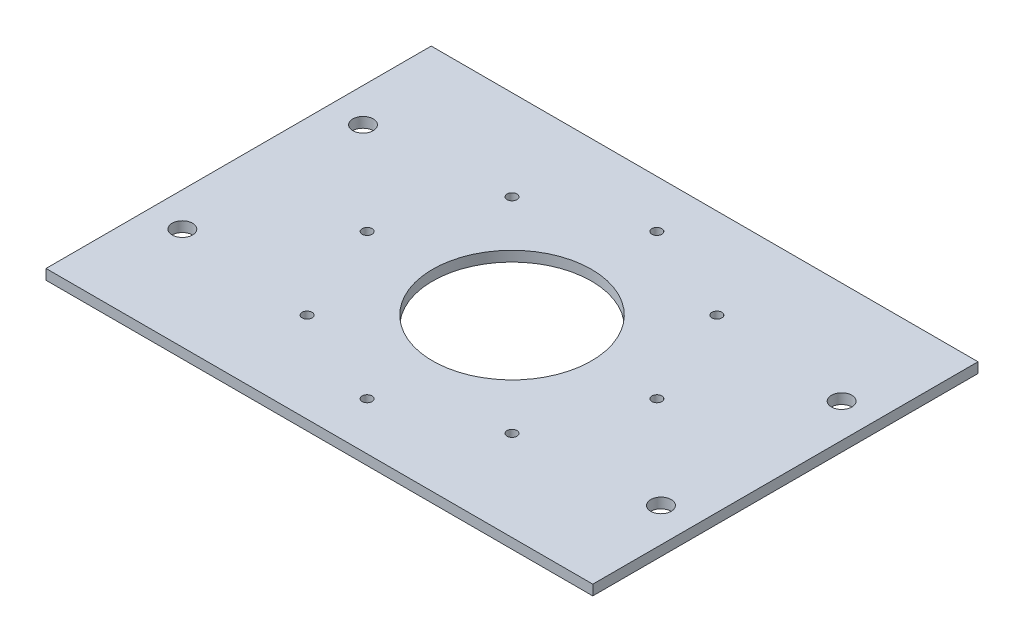
ISO-10303-21;
HEADER;
FILE_DESCRIPTION(('STEP AP214'),'2;1');
FILE_NAME('part.step','',(''),(''),'','','');
FILE_SCHEMA(('AUTOMOTIVE_DESIGN { 1 0 10303 214 1 1 1 1 }'));
ENDSEC;
DATA;
#1=APPLICATION_CONTEXT('core data for automotive mechanical design processes');
#2=APPLICATION_PROTOCOL_DEFINITION('international standard','automotive_design',2000,#1);
#3=PRODUCT_CONTEXT('',#1,'mechanical');
#4=PRODUCT('Part','Part','',(#3));
#5=PRODUCT_RELATED_PRODUCT_CATEGORY('part','',(#4));
#6=PRODUCT_DEFINITION_FORMATION('','',#4);
#7=PRODUCT_DEFINITION_CONTEXT('part definition',#1,'design');
#8=PRODUCT_DEFINITION('design','',#6,#7);
#9=PRODUCT_DEFINITION_SHAPE('','',#8);
#10=(LENGTH_UNIT() NAMED_UNIT(*) SI_UNIT(.MILLI.,.METRE.));
#11=(NAMED_UNIT(*) PLANE_ANGLE_UNIT() SI_UNIT($,.RADIAN.));
#12=(NAMED_UNIT(*) SI_UNIT($,.STERADIAN.) SOLID_ANGLE_UNIT());
#13=UNCERTAINTY_MEASURE_WITH_UNIT(LENGTH_MEASURE(1.E-05),#10,'distance_accuracy_value','');
#14=(GEOMETRIC_REPRESENTATION_CONTEXT(3) GLOBAL_UNCERTAINTY_ASSIGNED_CONTEXT((#13)) GLOBAL_UNIT_ASSIGNED_CONTEXT((#10,
#11,#12)) REPRESENTATION_CONTEXT('',''));
#15=CARTESIAN_POINT('',(0.,0.,0.));
#16=DIRECTION('',(0.,0.,1.));
#17=DIRECTION('',(1.,0.,0.));
#18=AXIS2_PLACEMENT_3D('',#15,#16,#17);
#19=CARTESIAN_POINT('',(80.2,3.,-56.5));
#20=DIRECTION('',(-1.,0.,0.));
#21=DIRECTION('',(0.,0.,1.));
#22=AXIS2_PLACEMENT_3D('',#19,#20,#21);
#23=PLANE('',#22);
#24=DIRECTION('',(0.,0.,-1.));
#25=VECTOR('',#24,1.);
#26=CARTESIAN_POINT('',(80.2,0.,-56.5));
#27=LINE('',#26,#25);
#28=CARTESIAN_POINT('',(80.2,0.,56.5));
#29=VERTEX_POINT('',#28);
#30=CARTESIAN_POINT('',(80.2,0.,-56.5));
#31=VERTEX_POINT('',#30);
#32=EDGE_CURVE('E107',#29,#31,#27,.T.);
#33=ORIENTED_EDGE('',*,*,#32,.T.);
#34=DIRECTION('',(0.,-1.,0.));
#35=VECTOR('',#34,1.);
#36=CARTESIAN_POINT('',(80.2,3.,-56.5));
#37=LINE('',#36,#35);
#38=CARTESIAN_POINT('',(80.2,3.,-56.5));
#39=VERTEX_POINT('',#38);
#40=EDGE_CURVE('E11',#39,#31,#37,.T.);
#41=ORIENTED_EDGE('',*,*,#40,.F.);
#42=DIRECTION('',(0.,0.,-1.));
#43=VECTOR('',#42,1.);
#44=CARTESIAN_POINT('',(80.2,3.,-56.5));
#45=LINE('',#44,#43);
#46=CARTESIAN_POINT('',(80.2,3.,56.5));
#47=VERTEX_POINT('',#46);
#48=EDGE_CURVE('E95',#47,#39,#45,.T.);
#49=ORIENTED_EDGE('',*,*,#48,.F.);
#50=DIRECTION('',(0.,-1.,0.));
#51=VECTOR('',#50,1.);
#52=CARTESIAN_POINT('',(80.2,3.,56.5));
#53=LINE('',#52,#51);
#54=EDGE_CURVE('E103',#47,#29,#53,.T.);
#55=ORIENTED_EDGE('',*,*,#54,.T.);
#56=EDGE_LOOP('',(#33,#41,#49,#55));
#57=FACE_BOUND('',#56,.T.);
#58=ADVANCED_FACE('F44',(#57),#23,.F.);
#59=CARTESIAN_POINT('',(-80.2,3.,-56.5));
#60=DIRECTION('',(0.,0.,1.));
#61=DIRECTION('',(1.,0.,0.));
#62=AXIS2_PLACEMENT_3D('',#59,#60,#61);
#63=PLANE('',#62);
#64=DIRECTION('',(-1.,0.,0.));
#65=VECTOR('',#64,1.);
#66=CARTESIAN_POINT('',(-80.2,0.,-56.5));
#67=LINE('',#66,#65);
#68=CARTESIAN_POINT('',(-80.2,0.,-56.5));
#69=VERTEX_POINT('',#68);
#70=EDGE_CURVE('E99',#31,#69,#67,.T.);
#71=ORIENTED_EDGE('',*,*,#70,.T.);
#72=DIRECTION('',(0.,-1.,0.));
#73=VECTOR('',#72,1.);
#74=CARTESIAN_POINT('',(-80.2,3.,-56.5));
#75=LINE('',#74,#73);
#76=CARTESIAN_POINT('',(-80.2,3.,-56.5));
#77=VERTEX_POINT('',#76);
#78=EDGE_CURVE('E52',#77,#69,#75,.T.);
#79=ORIENTED_EDGE('',*,*,#78,.F.);
#80=DIRECTION('',(-1.,0.,0.));
#81=VECTOR('',#80,1.);
#82=CARTESIAN_POINT('',(-80.2,3.,-56.5));
#83=LINE('',#82,#81);
#84=EDGE_CURVE('E90',#39,#77,#83,.T.);
#85=ORIENTED_EDGE('',*,*,#84,.F.);
#86=ORIENTED_EDGE('',*,*,#40,.T.);
#87=EDGE_LOOP('',(#71,#79,#85,#86));
#88=FACE_BOUND('',#87,.T.);
#89=ADVANCED_FACE('F98',(#88),#63,.F.);
#90=CARTESIAN_POINT('',(-80.2,3.,-56.5));
#91=DIRECTION('',(1.,0.,0.));
#92=DIRECTION('',(0.,0.,-1.));
#93=AXIS2_PLACEMENT_3D('',#90,#91,#92);
#94=PLANE('',#93);
#95=DIRECTION('',(0.,0.,1.));
#96=VECTOR('',#95,1.);
#97=CARTESIAN_POINT('',(-80.2,0.,-56.5));
#98=LINE('',#97,#96);
#99=CARTESIAN_POINT('',(-80.2,0.,56.5));
#100=VERTEX_POINT('',#99);
#101=EDGE_CURVE('E77',#69,#100,#98,.T.);
#102=ORIENTED_EDGE('',*,*,#101,.T.);
#103=DIRECTION('',(0.,-1.,0.));
#104=VECTOR('',#103,1.);
#105=CARTESIAN_POINT('',(-80.2,3.,56.5));
#106=LINE('',#105,#104);
#107=CARTESIAN_POINT('',(-80.2,3.,56.5));
#108=VERTEX_POINT('',#107);
#109=EDGE_CURVE('E100',#108,#100,#106,.T.);
#110=ORIENTED_EDGE('',*,*,#109,.F.);
#111=DIRECTION('',(0.,0.,1.));
#112=VECTOR('',#111,1.);
#113=CARTESIAN_POINT('',(-80.2,3.,-56.5));
#114=LINE('',#113,#112);
#115=EDGE_CURVE('E93',#77,#108,#114,.T.);
#116=ORIENTED_EDGE('',*,*,#115,.F.);
#117=ORIENTED_EDGE('',*,*,#78,.T.);
#118=EDGE_LOOP('',(#102,#110,#116,#117));
#119=FACE_BOUND('',#118,.T.);
#120=ADVANCED_FACE('F101',(#119),#94,.F.);
#121=CARTESIAN_POINT('',(-80.2,3.,56.5));
#122=DIRECTION('',(0.,0.,-1.));
#123=DIRECTION('',(-1.,0.,0.));
#124=AXIS2_PLACEMENT_3D('',#121,#122,#123);
#125=PLANE('',#124);
#126=DIRECTION('',(1.,0.,0.));
#127=VECTOR('',#126,1.);
#128=CARTESIAN_POINT('',(-80.2,0.,56.5));
#129=LINE('',#128,#127);
#130=EDGE_CURVE('E83',#100,#29,#129,.T.);
#131=ORIENTED_EDGE('',*,*,#130,.T.);
#132=ORIENTED_EDGE('',*,*,#54,.F.);
#133=DIRECTION('',(1.,0.,0.));
#134=VECTOR('',#133,1.);
#135=CARTESIAN_POINT('',(-80.2,3.,56.5));
#136=LINE('',#135,#134);
#137=EDGE_CURVE('E60',#108,#47,#136,.T.);
#138=ORIENTED_EDGE('',*,*,#137,.F.);
#139=ORIENTED_EDGE('',*,*,#109,.T.);
#140=EDGE_LOOP('',(#131,#132,#138,#139));
#141=FACE_BOUND('',#140,.T.);
#142=ADVANCED_FACE('F115',(#141),#125,.F.);
#143=CARTESIAN_POINT('',(0.,3.,0.));
#144=DIRECTION('',(0.,1.,0.));
#145=DIRECTION('',(0.,0.,1.));
#146=AXIS2_PLACEMENT_3D('',#143,#144,#145);
#147=PLANE('',#146);
#148=CARTESIAN_POINT('',(-70.2,3.,26.5));
#149=DIRECTION('',(0.,1.,0.));
#150=DIRECTION('',(0.,0.,1.));
#151=AXIS2_PLACEMENT_3D('',#148,#149,#150);
#152=CIRCLE('',#151,3.00000000000001);
#153=CARTESIAN_POINT('',(-70.2,3.,29.5));
#154=VERTEX_POINT('',#153);
#155=EDGE_CURVE('E178',#154,#154,#152,.T.);
#156=ORIENTED_EDGE('',*,*,#155,.F.);
#157=EDGE_LOOP('',(#156));
#158=FACE_BOUND('',#157,.T.);
#159=CARTESIAN_POINT('',(70.1985132365351,3.,-26.5000000000023));
#160=DIRECTION('',(0.,1.,0.));
#161=DIRECTION('',(0.,0.,1.));
#162=AXIS2_PLACEMENT_3D('',#159,#160,#161);
#163=CIRCLE('',#162,3.00000000000001);
#164=CARTESIAN_POINT('',(70.1985132365351,3.,-23.5000000000023));
#165=VERTEX_POINT('',#164);
#166=EDGE_CURVE('E184',#165,#165,#163,.T.);
#167=ORIENTED_EDGE('',*,*,#166,.F.);
#168=EDGE_LOOP('',(#167));
#169=FACE_BOUND('',#168,.T.);
#170=CARTESIAN_POINT('',(-70.2000000000001,3.,-26.5000000000024));
#171=DIRECTION('',(0.,1.,0.));
#172=DIRECTION('',(0.,0.,1.));
#173=AXIS2_PLACEMENT_3D('',#170,#171,#172);
#174=CIRCLE('',#173,3.00000000000001);
#175=CARTESIAN_POINT('',(-70.2000000000001,3.,-23.5000000000023));
#176=VERTEX_POINT('',#175);
#177=EDGE_CURVE('E185',#176,#176,#174,.T.);
#178=ORIENTED_EDGE('',*,*,#177,.F.);
#179=EDGE_LOOP('',(#178));
#180=FACE_BOUND('',#179,.T.);
#181=CARTESIAN_POINT('',(70.1985132365351,3.,26.5));
#182=DIRECTION('',(0.,1.,0.));
#183=DIRECTION('',(0.,0.,1.));
#184=AXIS2_PLACEMENT_3D('',#181,#182,#183);
#185=CIRCLE('',#184,3.00000000000001);
#186=CARTESIAN_POINT('',(70.1985132365351,3.,29.5));
#187=VERTEX_POINT('',#186);
#188=EDGE_CURVE('E175',#187,#187,#185,.T.);
#189=ORIENTED_EDGE('',*,*,#188,.F.);
#190=EDGE_LOOP('',(#189));
#191=FACE_BOUND('',#190,.T.);
#192=CARTESIAN_POINT('',(0.,3.,0.));
#193=DIRECTION('',(0.,-1.,0.));
#194=DIRECTION('',(0.,0.,-1.));
#195=AXIS2_PLACEMENT_3D('',#192,#193,#194);
#196=CIRCLE('',#195,23.2974996960863);
#197=CARTESIAN_POINT('',(0.,3.,-23.2974996960863));
#198=VERTEX_POINT('',#197);
#199=EDGE_CURVE('E125',#198,#198,#196,.T.);
#200=ORIENTED_EDGE('',*,*,#199,.T.);
#201=EDGE_LOOP('',(#200));
#202=FACE_BOUND('',#201,.T.);
#203=CARTESIAN_POINT('',(0.,3.,42.5));
#204=DIRECTION('',(0.,1.,0.));
#205=DIRECTION('',(0.,0.,1.));
#206=AXIS2_PLACEMENT_3D('',#203,#204,#205);
#207=CIRCLE('',#206,1.45);
#208=CARTESIAN_POINT('',(0.,3.,43.95));
#209=VERTEX_POINT('',#208);
#210=EDGE_CURVE('E164',#209,#209,#207,.T.);
#211=ORIENTED_EDGE('',*,*,#210,.F.);
#212=EDGE_LOOP('',(#211));
#213=FACE_BOUND('',#212,.T.);
#214=CARTESIAN_POINT('',(-30.0520382004283,3.,30.0520382004282));
#215=DIRECTION('',(0.,1.,0.));
#216=DIRECTION('',(0.,0.,1.));
#217=AXIS2_PLACEMENT_3D('',#214,#215,#216);
#218=CIRCLE('',#217,1.45);
#219=CARTESIAN_POINT('',(-30.0520382004283,3.,31.5020382004282));
#220=VERTEX_POINT('',#219);
#221=EDGE_CURVE('E161',#220,#220,#218,.T.);
#222=ORIENTED_EDGE('',*,*,#221,.F.);
#223=EDGE_LOOP('',(#222));
#224=FACE_BOUND('',#223,.T.);
#225=CARTESIAN_POINT('',(-42.5,3.,-1.48387956900833E-13));
#226=DIRECTION('',(0.,1.,0.));
#227=DIRECTION('',(0.,0.,1.));
#228=AXIS2_PLACEMENT_3D('',#225,#226,#227);
#229=CIRCLE('',#228,1.45);
#230=CARTESIAN_POINT('',(-42.5,3.,1.44999999999985));
#231=VERTEX_POINT('',#230);
#232=EDGE_CURVE('E155',#231,#231,#229,.T.);
#233=ORIENTED_EDGE('',*,*,#232,.F.);
#234=EDGE_LOOP('',(#233));
#235=FACE_BOUND('',#234,.T.);
#236=CARTESIAN_POINT('',(-30.0520382004281,3.,-30.0520382004284));
#237=DIRECTION('',(0.,1.,0.));
#238=DIRECTION('',(0.,0.,1.));
#239=AXIS2_PLACEMENT_3D('',#236,#237,#238);
#240=CIRCLE('',#239,1.45);
#241=CARTESIAN_POINT('',(-30.0520382004281,3.,-28.6020382004284));
#242=VERTEX_POINT('',#241);
#243=EDGE_CURVE('E149',#242,#242,#240,.T.);
#244=ORIENTED_EDGE('',*,*,#243,.F.);
#245=EDGE_LOOP('',(#244));
#246=FACE_BOUND('',#245,.T.);
#247=CARTESIAN_POINT('',(2.96775913801666E-13,3.,-42.5));
#248=DIRECTION('',(0.,1.,0.));
#249=DIRECTION('',(0.,0.,1.));
#250=AXIS2_PLACEMENT_3D('',#247,#248,#249);
#251=CIRCLE('',#250,1.45);
#252=CARTESIAN_POINT('',(2.96775913801666E-13,3.,-41.05));
#253=VERTEX_POINT('',#252);
#254=EDGE_CURVE('E143',#253,#253,#251,.T.);
#255=ORIENTED_EDGE('',*,*,#254,.F.);
#256=EDGE_LOOP('',(#255));
#257=FACE_BOUND('',#256,.T.);
#258=CARTESIAN_POINT('',(30.0520382004285,3.,-30.052038200428));
#259=DIRECTION('',(0.,1.,0.));
#260=DIRECTION('',(0.,0.,1.));
#261=AXIS2_PLACEMENT_3D('',#258,#259,#260);
#262=CIRCLE('',#261,1.45);
#263=CARTESIAN_POINT('',(30.0520382004285,3.,-28.602038200428));
#264=VERTEX_POINT('',#263);
#265=EDGE_CURVE('E137',#264,#264,#262,.T.);
#266=ORIENTED_EDGE('',*,*,#265,.F.);
#267=EDGE_LOOP('',(#266));
#268=FACE_BOUND('',#267,.T.);
#269=CARTESIAN_POINT('',(42.5,3.,4.451638707025E-13));
#270=DIRECTION('',(0.,1.,0.));
#271=DIRECTION('',(0.,0.,1.));
#272=AXIS2_PLACEMENT_3D('',#269,#270,#271);
#273=CIRCLE('',#272,1.45);
#274=CARTESIAN_POINT('',(42.5,3.,1.45000000000045));
#275=VERTEX_POINT('',#274);
#276=EDGE_CURVE('E131',#275,#275,#273,.T.);
#277=ORIENTED_EDGE('',*,*,#276,.F.);
#278=EDGE_LOOP('',(#277));
#279=FACE_BOUND('',#278,.T.);
#280=CARTESIAN_POINT('',(30.0520382004279,3.,30.0520382004286));
#281=DIRECTION('',(0.,1.,0.));
#282=DIRECTION('',(0.,0.,1.));
#283=AXIS2_PLACEMENT_3D('',#280,#281,#282);
#284=CIRCLE('',#283,1.45);
#285=CARTESIAN_POINT('',(30.0520382004279,3.,31.5020382004286));
#286=VERTEX_POINT('',#285);
#287=EDGE_CURVE('E124',#286,#286,#284,.T.);
#288=ORIENTED_EDGE('',*,*,#287,.F.);
#289=EDGE_LOOP('',(#288));
#290=FACE_BOUND('',#289,.T.);
#291=ORIENTED_EDGE('',*,*,#48,.T.);
#292=ORIENTED_EDGE('',*,*,#84,.T.);
#293=ORIENTED_EDGE('',*,*,#115,.T.);
#294=ORIENTED_EDGE('',*,*,#137,.T.);
#295=EDGE_LOOP('',(#291,#292,#293,#294));
#296=FACE_BOUND('',#295,.T.);
#297=ADVANCED_FACE('F91',(#158,#169,#180,#191,#202,#213,#224,#235,#246,#257,#268,#279,#290,
#296),#147,.T.);
#298=CARTESIAN_POINT('',(0.,0.,0.));
#299=DIRECTION('',(0.,1.,0.));
#300=DIRECTION('',(0.,0.,1.));
#301=AXIS2_PLACEMENT_3D('',#298,#299,#300);
#302=PLANE('',#301);
#303=CARTESIAN_POINT('',(-70.2,0.,26.5));
#304=DIRECTION('',(0.,1.,0.));
#305=DIRECTION('',(0.,0.,1.));
#306=AXIS2_PLACEMENT_3D('',#303,#304,#305);
#307=CIRCLE('',#306,3.00000000000001);
#308=CARTESIAN_POINT('',(-70.2,0.,29.5));
#309=VERTEX_POINT('',#308);
#310=EDGE_CURVE('E188',#309,#309,#307,.T.);
#311=ORIENTED_EDGE('',*,*,#310,.T.);
#312=EDGE_LOOP('',(#311));
#313=FACE_BOUND('',#312,.T.);
#314=CARTESIAN_POINT('',(70.1985132365351,0.,-26.5000000000023));
#315=DIRECTION('',(0.,1.,0.));
#316=DIRECTION('',(0.,0.,1.));
#317=AXIS2_PLACEMENT_3D('',#314,#315,#316);
#318=CIRCLE('',#317,3.00000000000001);
#319=CARTESIAN_POINT('',(70.1985132365351,0.,-23.5000000000023));
#320=VERTEX_POINT('',#319);
#321=EDGE_CURVE('E181',#320,#320,#318,.T.);
#322=ORIENTED_EDGE('',*,*,#321,.T.);
#323=EDGE_LOOP('',(#322));
#324=FACE_BOUND('',#323,.T.);
#325=CARTESIAN_POINT('',(-70.2000000000001,0.,-26.5000000000024));
#326=DIRECTION('',(0.,1.,0.));
#327=DIRECTION('',(0.,0.,1.));
#328=AXIS2_PLACEMENT_3D('',#325,#326,#327);
#329=CIRCLE('',#328,3.00000000000001);
#330=CARTESIAN_POINT('',(-70.2000000000001,0.,-23.5000000000023));
#331=VERTEX_POINT('',#330);
#332=EDGE_CURVE('E193',#331,#331,#329,.T.);
#333=ORIENTED_EDGE('',*,*,#332,.T.);
#334=EDGE_LOOP('',(#333));
#335=FACE_BOUND('',#334,.T.);
#336=CARTESIAN_POINT('',(70.1985132365351,0.,26.5));
#337=DIRECTION('',(0.,1.,0.));
#338=DIRECTION('',(0.,0.,1.));
#339=AXIS2_PLACEMENT_3D('',#336,#337,#338);
#340=CIRCLE('',#339,3.00000000000001);
#341=CARTESIAN_POINT('',(70.1985132365351,0.,29.5));
#342=VERTEX_POINT('',#341);
#343=EDGE_CURVE('E172',#342,#342,#340,.T.);
#344=ORIENTED_EDGE('',*,*,#343,.T.);
#345=EDGE_LOOP('',(#344));
#346=FACE_BOUND('',#345,.T.);
#347=CARTESIAN_POINT('',(0.,0.,0.));
#348=DIRECTION('',(0.,-1.,0.));
#349=DIRECTION('',(0.,0.,-1.));
#350=AXIS2_PLACEMENT_3D('',#347,#348,#349);
#351=CIRCLE('',#350,23.2974996960863);
#352=CARTESIAN_POINT('',(0.,0.,-23.2974996960863));
#353=VERTEX_POINT('',#352);
#354=EDGE_CURVE('E169',#353,#353,#351,.T.);
#355=ORIENTED_EDGE('',*,*,#354,.F.);
#356=EDGE_LOOP('',(#355));
#357=FACE_BOUND('',#356,.T.);
#358=CARTESIAN_POINT('',(0.,0.,42.5));
#359=DIRECTION('',(0.,1.,0.));
#360=DIRECTION('',(0.,0.,1.));
#361=AXIS2_PLACEMENT_3D('',#358,#359,#360);
#362=CIRCLE('',#361,1.45);
#363=CARTESIAN_POINT('',(0.,0.,43.95));
#364=VERTEX_POINT('',#363);
#365=EDGE_CURVE('E110',#364,#364,#362,.T.);
#366=ORIENTED_EDGE('',*,*,#365,.T.);
#367=EDGE_LOOP('',(#366));
#368=FACE_BOUND('',#367,.T.);
#369=CARTESIAN_POINT('',(-30.0520382004283,0.,30.0520382004282));
#370=DIRECTION('',(0.,1.,0.));
#371=DIRECTION('',(0.,0.,1.));
#372=AXIS2_PLACEMENT_3D('',#369,#370,#371);
#373=CIRCLE('',#372,1.45);
#374=CARTESIAN_POINT('',(-30.0520382004283,0.,31.5020382004282));
#375=VERTEX_POINT('',#374);
#376=EDGE_CURVE('E158',#375,#375,#373,.T.);
#377=ORIENTED_EDGE('',*,*,#376,.T.);
#378=EDGE_LOOP('',(#377));
#379=FACE_BOUND('',#378,.T.);
#380=CARTESIAN_POINT('',(-42.5,0.,-1.48387956900833E-13));
#381=DIRECTION('',(0.,1.,0.));
#382=DIRECTION('',(0.,0.,1.));
#383=AXIS2_PLACEMENT_3D('',#380,#381,#382);
#384=CIRCLE('',#383,1.45);
#385=CARTESIAN_POINT('',(-42.5,0.,1.44999999999985));
#386=VERTEX_POINT('',#385);
#387=EDGE_CURVE('E152',#386,#386,#384,.T.);
#388=ORIENTED_EDGE('',*,*,#387,.T.);
#389=EDGE_LOOP('',(#388));
#390=FACE_BOUND('',#389,.T.);
#391=CARTESIAN_POINT('',(-30.0520382004281,0.,-30.0520382004284));
#392=DIRECTION('',(0.,1.,0.));
#393=DIRECTION('',(0.,0.,1.));
#394=AXIS2_PLACEMENT_3D('',#391,#392,#393);
#395=CIRCLE('',#394,1.45);
#396=CARTESIAN_POINT('',(-30.0520382004281,0.,-28.6020382004284));
#397=VERTEX_POINT('',#396);
#398=EDGE_CURVE('E146',#397,#397,#395,.T.);
#399=ORIENTED_EDGE('',*,*,#398,.T.);
#400=EDGE_LOOP('',(#399));
#401=FACE_BOUND('',#400,.T.);
#402=CARTESIAN_POINT('',(2.96775913801666E-13,0.,-42.5));
#403=DIRECTION('',(0.,1.,0.));
#404=DIRECTION('',(0.,0.,1.));
#405=AXIS2_PLACEMENT_3D('',#402,#403,#404);
#406=CIRCLE('',#405,1.45);
#407=CARTESIAN_POINT('',(2.96775913801666E-13,0.,-41.05));
#408=VERTEX_POINT('',#407);
#409=EDGE_CURVE('E140',#408,#408,#406,.T.);
#410=ORIENTED_EDGE('',*,*,#409,.T.);
#411=EDGE_LOOP('',(#410));
#412=FACE_BOUND('',#411,.T.);
#413=CARTESIAN_POINT('',(30.0520382004285,0.,-30.052038200428));
#414=DIRECTION('',(0.,1.,0.));
#415=DIRECTION('',(0.,0.,1.));
#416=AXIS2_PLACEMENT_3D('',#413,#414,#415);
#417=CIRCLE('',#416,1.45);
#418=CARTESIAN_POINT('',(30.0520382004285,0.,-28.602038200428));
#419=VERTEX_POINT('',#418);
#420=EDGE_CURVE('E134',#419,#419,#417,.T.);
#421=ORIENTED_EDGE('',*,*,#420,.T.);
#422=EDGE_LOOP('',(#421));
#423=FACE_BOUND('',#422,.T.);
#424=CARTESIAN_POINT('',(42.5,0.,4.451638707025E-13));
#425=DIRECTION('',(0.,1.,0.));
#426=DIRECTION('',(0.,0.,1.));
#427=AXIS2_PLACEMENT_3D('',#424,#425,#426);
#428=CIRCLE('',#427,1.45);
#429=CARTESIAN_POINT('',(42.5,0.,1.45000000000045));
#430=VERTEX_POINT('',#429);
#431=EDGE_CURVE('E128',#430,#430,#428,.T.);
#432=ORIENTED_EDGE('',*,*,#431,.T.);
#433=EDGE_LOOP('',(#432));
#434=FACE_BOUND('',#433,.T.);
#435=CARTESIAN_POINT('',(30.0520382004279,0.,30.0520382004286));
#436=DIRECTION('',(0.,1.,0.));
#437=DIRECTION('',(0.,0.,1.));
#438=AXIS2_PLACEMENT_3D('',#435,#436,#437);
#439=CIRCLE('',#438,1.45);
#440=CARTESIAN_POINT('',(30.0520382004279,0.,31.5020382004286));
#441=VERTEX_POINT('',#440);
#442=EDGE_CURVE('E121',#441,#441,#439,.T.);
#443=ORIENTED_EDGE('',*,*,#442,.T.);
#444=EDGE_LOOP('',(#443));
#445=FACE_BOUND('',#444,.T.);
#446=ORIENTED_EDGE('',*,*,#32,.F.);
#447=ORIENTED_EDGE('',*,*,#130,.F.);
#448=ORIENTED_EDGE('',*,*,#101,.F.);
#449=ORIENTED_EDGE('',*,*,#70,.F.);
#450=EDGE_LOOP('',(#446,#447,#448,#449));
#451=FACE_BOUND('',#450,.T.);
#452=ADVANCED_FACE('F118',(#313,#324,#335,#346,#357,#368,#379,#390,#401,#412,#423,#434,#445,
#451),#302,.F.);
#453=CARTESIAN_POINT('',(30.0520382004279,0.,30.0520382004286));
#454=DIRECTION('',(0.,1.,0.));
#455=DIRECTION('',(0.,0.,1.));
#456=AXIS2_PLACEMENT_3D('',#453,#454,#455);
#457=CYLINDRICAL_SURFACE('',#456,1.45);
#458=ORIENTED_EDGE('',*,*,#442,.F.);
#459=EDGE_LOOP('',(#458));
#460=FACE_BOUND('',#459,.T.);
#461=ORIENTED_EDGE('',*,*,#287,.T.);
#462=EDGE_LOOP('',(#461));
#463=FACE_BOUND('',#462,.T.);
#464=ADVANCED_FACE('F225',(#460,#463),#457,.F.);
#465=CARTESIAN_POINT('',(42.5,0.,4.451638707025E-13));
#466=DIRECTION('',(0.,1.,0.));
#467=DIRECTION('',(0.,0.,1.));
#468=AXIS2_PLACEMENT_3D('',#465,#466,#467);
#469=CYLINDRICAL_SURFACE('',#468,1.45);
#470=ORIENTED_EDGE('',*,*,#431,.F.);
#471=EDGE_LOOP('',(#470));
#472=FACE_BOUND('',#471,.T.);
#473=ORIENTED_EDGE('',*,*,#276,.T.);
#474=EDGE_LOOP('',(#473));
#475=FACE_BOUND('',#474,.T.);
#476=ADVANCED_FACE('F227',(#472,#475),#469,.F.);
#477=CARTESIAN_POINT('',(30.0520382004285,0.,-30.052038200428));
#478=DIRECTION('',(0.,1.,0.));
#479=DIRECTION('',(0.,0.,1.));
#480=AXIS2_PLACEMENT_3D('',#477,#478,#479);
#481=CYLINDRICAL_SURFACE('',#480,1.45);
#482=ORIENTED_EDGE('',*,*,#420,.F.);
#483=EDGE_LOOP('',(#482));
#484=FACE_BOUND('',#483,.T.);
#485=ORIENTED_EDGE('',*,*,#265,.T.);
#486=EDGE_LOOP('',(#485));
#487=FACE_BOUND('',#486,.T.);
#488=ADVANCED_FACE('F234',(#484,#487),#481,.F.);
#489=CARTESIAN_POINT('',(2.96775913801666E-13,0.,-42.5));
#490=DIRECTION('',(0.,1.,0.));
#491=DIRECTION('',(0.,0.,1.));
#492=AXIS2_PLACEMENT_3D('',#489,#490,#491);
#493=CYLINDRICAL_SURFACE('',#492,1.45);
#494=ORIENTED_EDGE('',*,*,#409,.F.);
#495=EDGE_LOOP('',(#494));
#496=FACE_BOUND('',#495,.T.);
#497=ORIENTED_EDGE('',*,*,#254,.T.);
#498=EDGE_LOOP('',(#497));
#499=FACE_BOUND('',#498,.T.);
#500=ADVANCED_FACE('F282',(#496,#499),#493,.F.);
#501=CARTESIAN_POINT('',(-30.0520382004281,0.,-30.0520382004284));
#502=DIRECTION('',(0.,1.,0.));
#503=DIRECTION('',(0.,0.,1.));
#504=AXIS2_PLACEMENT_3D('',#501,#502,#503);
#505=CYLINDRICAL_SURFACE('',#504,1.45);
#506=ORIENTED_EDGE('',*,*,#398,.F.);
#507=EDGE_LOOP('',(#506));
#508=FACE_BOUND('',#507,.T.);
#509=ORIENTED_EDGE('',*,*,#243,.T.);
#510=EDGE_LOOP('',(#509));
#511=FACE_BOUND('',#510,.T.);
#512=ADVANCED_FACE('F292',(#508,#511),#505,.F.);
#513=CARTESIAN_POINT('',(-42.5,0.,-1.48387956900833E-13));
#514=DIRECTION('',(0.,1.,0.));
#515=DIRECTION('',(0.,0.,1.));
#516=AXIS2_PLACEMENT_3D('',#513,#514,#515);
#517=CYLINDRICAL_SURFACE('',#516,1.45);
#518=ORIENTED_EDGE('',*,*,#387,.F.);
#519=EDGE_LOOP('',(#518));
#520=FACE_BOUND('',#519,.T.);
#521=ORIENTED_EDGE('',*,*,#232,.T.);
#522=EDGE_LOOP('',(#521));
#523=FACE_BOUND('',#522,.T.);
#524=ADVANCED_FACE('F302',(#520,#523),#517,.F.);
#525=CARTESIAN_POINT('',(-30.0520382004283,0.,30.0520382004282));
#526=DIRECTION('',(0.,1.,0.));
#527=DIRECTION('',(0.,0.,1.));
#528=AXIS2_PLACEMENT_3D('',#525,#526,#527);
#529=CYLINDRICAL_SURFACE('',#528,1.45);
#530=ORIENTED_EDGE('',*,*,#376,.F.);
#531=EDGE_LOOP('',(#530));
#532=FACE_BOUND('',#531,.T.);
#533=ORIENTED_EDGE('',*,*,#221,.T.);
#534=EDGE_LOOP('',(#533));
#535=FACE_BOUND('',#534,.T.);
#536=ADVANCED_FACE('F312',(#532,#535),#529,.F.);
#537=CARTESIAN_POINT('',(0.,0.,42.5));
#538=DIRECTION('',(0.,1.,0.));
#539=DIRECTION('',(0.,0.,1.));
#540=AXIS2_PLACEMENT_3D('',#537,#538,#539);
#541=CYLINDRICAL_SURFACE('',#540,1.45);
#542=ORIENTED_EDGE('',*,*,#365,.F.);
#543=EDGE_LOOP('',(#542));
#544=FACE_BOUND('',#543,.T.);
#545=ORIENTED_EDGE('',*,*,#210,.T.);
#546=EDGE_LOOP('',(#545));
#547=FACE_BOUND('',#546,.T.);
#548=ADVANCED_FACE('F322',(#544,#547),#541,.F.);
#549=CARTESIAN_POINT('',(0.,3.,0.));
#550=DIRECTION('',(0.,-1.,0.));
#551=DIRECTION('',(0.,0.,-1.));
#552=AXIS2_PLACEMENT_3D('',#549,#550,#551);
#553=CYLINDRICAL_SURFACE('',#552,23.2974996960863);
#554=ORIENTED_EDGE('',*,*,#199,.F.);
#555=EDGE_LOOP('',(#554));
#556=FACE_BOUND('',#555,.T.);
#557=ORIENTED_EDGE('',*,*,#354,.T.);
#558=EDGE_LOOP('',(#557));
#559=FACE_BOUND('',#558,.T.);
#560=ADVANCED_FACE('F332',(#556,#559),#553,.F.);
#561=CARTESIAN_POINT('',(70.1985132365351,0.,26.5));
#562=DIRECTION('',(0.,1.,0.));
#563=DIRECTION('',(0.,0.,1.));
#564=AXIS2_PLACEMENT_3D('',#561,#562,#563);
#565=CYLINDRICAL_SURFACE('',#564,3.00000000000001);
#566=ORIENTED_EDGE('',*,*,#343,.F.);
#567=EDGE_LOOP('',(#566));
#568=FACE_BOUND('',#567,.T.);
#569=ORIENTED_EDGE('',*,*,#188,.T.);
#570=EDGE_LOOP('',(#569));
#571=FACE_BOUND('',#570,.T.);
#572=ADVANCED_FACE('F342',(#568,#571),#565,.F.);
#573=CARTESIAN_POINT('',(-70.2000000000001,0.,-26.5000000000024));
#574=DIRECTION('',(0.,1.,0.));
#575=DIRECTION('',(0.,0.,1.));
#576=AXIS2_PLACEMENT_3D('',#573,#574,#575);
#577=CYLINDRICAL_SURFACE('',#576,3.00000000000001);
#578=ORIENTED_EDGE('',*,*,#332,.F.);
#579=EDGE_LOOP('',(#578));
#580=FACE_BOUND('',#579,.T.);
#581=ORIENTED_EDGE('',*,*,#177,.T.);
#582=EDGE_LOOP('',(#581));
#583=FACE_BOUND('',#582,.T.);
#584=ADVANCED_FACE('F199',(#580,#583),#577,.F.);
#585=CARTESIAN_POINT('',(70.1985132365351,0.,-26.5000000000023));
#586=DIRECTION('',(0.,1.,0.));
#587=DIRECTION('',(0.,0.,1.));
#588=AXIS2_PLACEMENT_3D('',#585,#586,#587);
#589=CYLINDRICAL_SURFACE('',#588,3.00000000000001);
#590=ORIENTED_EDGE('',*,*,#321,.F.);
#591=EDGE_LOOP('',(#590));
#592=FACE_BOUND('',#591,.T.);
#593=ORIENTED_EDGE('',*,*,#166,.T.);
#594=EDGE_LOOP('',(#593));
#595=FACE_BOUND('',#594,.T.);
#596=ADVANCED_FACE('F360',(#592,#595),#589,.F.);
#597=CARTESIAN_POINT('',(-70.2,0.,26.5));
#598=DIRECTION('',(0.,1.,0.));
#599=DIRECTION('',(0.,0.,1.));
#600=AXIS2_PLACEMENT_3D('',#597,#598,#599);
#601=CYLINDRICAL_SURFACE('',#600,3.00000000000001);
#602=ORIENTED_EDGE('',*,*,#310,.F.);
#603=EDGE_LOOP('',(#602));
#604=FACE_BOUND('',#603,.T.);
#605=ORIENTED_EDGE('',*,*,#155,.T.);
#606=EDGE_LOOP('',(#605));
#607=FACE_BOUND('',#606,.T.);
#608=ADVANCED_FACE('F370',(#604,#607),#601,.F.);
#609=CLOSED_SHELL('',(#58,#89,#120,#142,#297,#452,#464,#476,#488,#500,#512,#524,#536,#548,#560,
#572,#584,#596,#608));
#610=MANIFOLD_SOLID_BREP('B2',#609);
#611=ADVANCED_BREP_SHAPE_REPRESENTATION('',(#18,#610),#14);
#612=SHAPE_DEFINITION_REPRESENTATION(#9,#611);
ENDSEC;
END-ISO-10303-21;
